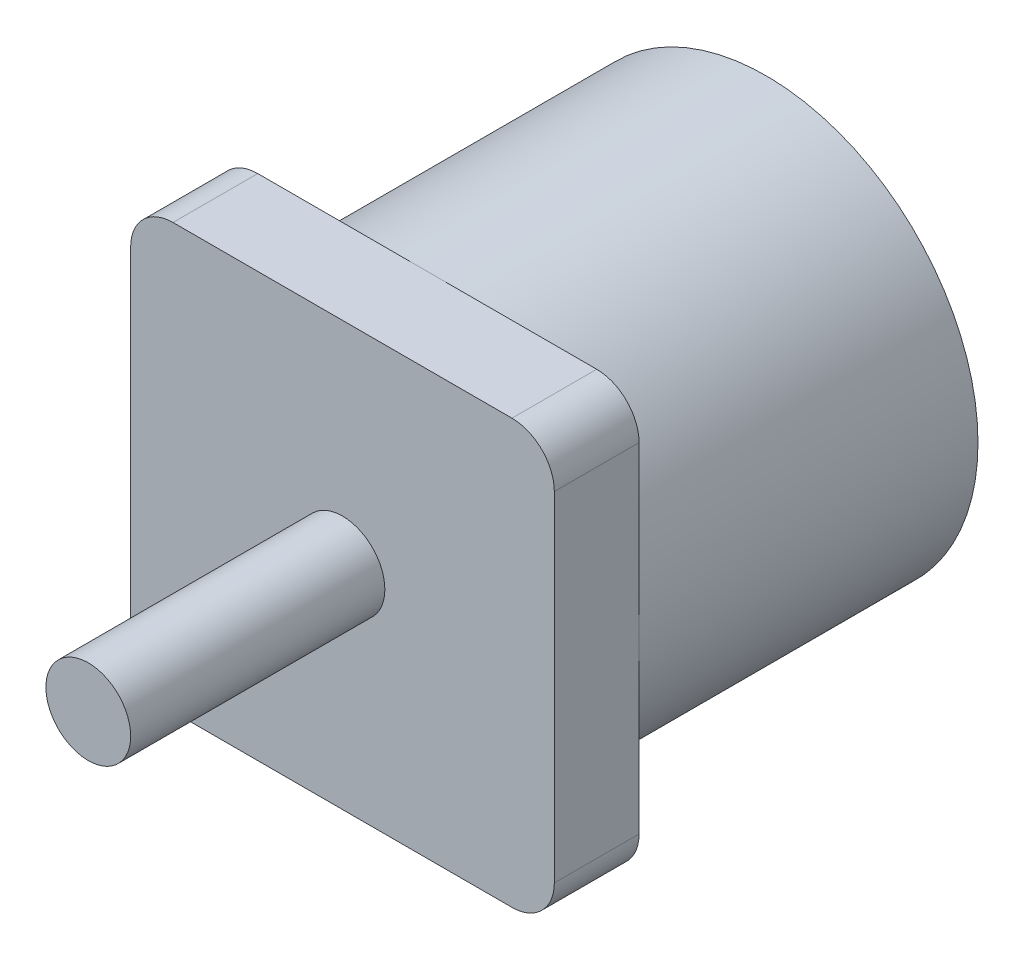
ISO-10303-21;
HEADER;
FILE_DESCRIPTION(('STEP AP214'),'2;1');
FILE_NAME('part.step','',(''),(''),'','','');
FILE_SCHEMA(('AUTOMOTIVE_DESIGN { 1 0 10303 214 1 1 1 1 }'));
ENDSEC;
DATA;
#1=APPLICATION_CONTEXT('core data for automotive mechanical design processes');
#2=APPLICATION_PROTOCOL_DEFINITION('international standard','automotive_design',2000,#1);
#3=PRODUCT_CONTEXT('',#1,'mechanical');
#4=PRODUCT('Part','Part','',(#3));
#5=PRODUCT_RELATED_PRODUCT_CATEGORY('part','',(#4));
#6=PRODUCT_DEFINITION_FORMATION('','',#4);
#7=PRODUCT_DEFINITION_CONTEXT('part definition',#1,'design');
#8=PRODUCT_DEFINITION('design','',#6,#7);
#9=PRODUCT_DEFINITION_SHAPE('','',#8);
#10=(LENGTH_UNIT() NAMED_UNIT(*) SI_UNIT(.MILLI.,.METRE.));
#11=(NAMED_UNIT(*) PLANE_ANGLE_UNIT() SI_UNIT($,.RADIAN.));
#12=(NAMED_UNIT(*) SI_UNIT($,.STERADIAN.) SOLID_ANGLE_UNIT());
#13=UNCERTAINTY_MEASURE_WITH_UNIT(LENGTH_MEASURE(1.E-05),#10,'distance_accuracy_value','');
#14=(GEOMETRIC_REPRESENTATION_CONTEXT(3) GLOBAL_UNCERTAINTY_ASSIGNED_CONTEXT((#13)) GLOBAL_UNIT_ASSIGNED_CONTEXT((#10,
#11,#12)) REPRESENTATION_CONTEXT('',''));
#15=CARTESIAN_POINT('',(0.,0.,0.));
#16=DIRECTION('',(0.,0.,1.));
#17=DIRECTION('',(1.,0.,0.));
#18=AXIS2_PLACEMENT_3D('',#15,#16,#17);
#19=CARTESIAN_POINT('',(0.,0.,50.));
#20=DIRECTION('',(0.,0.,1.));
#21=DIRECTION('',(1.,0.,0.));
#22=AXIS2_PLACEMENT_3D('',#19,#20,#21);
#23=PLANE('',#22);
#24=DIRECTION('',(-1.,0.,0.));
#25=VECTOR('',#24,1.);
#26=CARTESIAN_POINT('',(-25.,25.,50.));
#27=LINE('',#26,#25);
#28=CARTESIAN_POINT('',(20.,25.,50.));
#29=VERTEX_POINT('',#28);
#30=CARTESIAN_POINT('',(-20.,25.,50.));
#31=VERTEX_POINT('',#30);
#32=EDGE_CURVE('E158',#29,#31,#27,.T.);
#33=ORIENTED_EDGE('',*,*,#32,.T.);
#34=CARTESIAN_POINT('',(-20.,20.,50.));
#35=DIRECTION('',(0.,0.,1.));
#36=DIRECTION('',(1.,0.,0.));
#37=AXIS2_PLACEMENT_3D('',#34,#35,#36);
#38=CIRCLE('',#37,5.);
#39=CARTESIAN_POINT('',(-25.,20.,50.));
#40=VERTEX_POINT('',#39);
#41=EDGE_CURVE('E180',#31,#40,#38,.T.);
#42=ORIENTED_EDGE('',*,*,#41,.T.);
#43=DIRECTION('',(0.,-1.,0.));
#44=VECTOR('',#43,1.);
#45=CARTESIAN_POINT('',(-25.,25.,50.));
#46=LINE('',#45,#44);
#47=CARTESIAN_POINT('',(-25.,-20.,50.));
#48=VERTEX_POINT('',#47);
#49=EDGE_CURVE('E144',#40,#48,#46,.T.);
#50=ORIENTED_EDGE('',*,*,#49,.T.);
#51=CARTESIAN_POINT('',(-20.,-20.,50.));
#52=DIRECTION('',(0.,0.,1.));
#53=DIRECTION('',(1.,0.,0.));
#54=AXIS2_PLACEMENT_3D('',#51,#52,#53);
#55=CIRCLE('',#54,5.);
#56=CARTESIAN_POINT('',(-20.,-25.,50.));
#57=VERTEX_POINT('',#56);
#58=EDGE_CURVE('E178',#48,#57,#55,.T.);
#59=ORIENTED_EDGE('',*,*,#58,.T.);
#60=DIRECTION('',(1.,0.,0.));
#61=VECTOR('',#60,1.);
#62=CARTESIAN_POINT('',(-25.,-25.,50.));
#63=LINE('',#62,#61);
#64=CARTESIAN_POINT('',(20.,-25.,50.));
#65=VERTEX_POINT('',#64);
#66=EDGE_CURVE('E142',#57,#65,#63,.T.);
#67=ORIENTED_EDGE('',*,*,#66,.T.);
#68=CARTESIAN_POINT('',(20.,-20.,50.));
#69=DIRECTION('',(0.,0.,1.));
#70=DIRECTION('',(1.,0.,0.));
#71=AXIS2_PLACEMENT_3D('',#68,#69,#70);
#72=CIRCLE('',#71,5.);
#73=CARTESIAN_POINT('',(25.,-20.,50.));
#74=VERTEX_POINT('',#73);
#75=EDGE_CURVE('E176',#65,#74,#72,.T.);
#76=ORIENTED_EDGE('',*,*,#75,.T.);
#77=DIRECTION('',(0.,1.,0.));
#78=VECTOR('',#77,1.);
#79=CARTESIAN_POINT('',(25.,25.,50.));
#80=LINE('',#79,#78);
#81=CARTESIAN_POINT('',(25.,20.,50.));
#82=VERTEX_POINT('',#81);
#83=EDGE_CURVE('E155',#74,#82,#80,.T.);
#84=ORIENTED_EDGE('',*,*,#83,.T.);
#85=CARTESIAN_POINT('',(20.,20.,50.));
#86=DIRECTION('',(0.,0.,1.));
#87=DIRECTION('',(1.,0.,0.));
#88=AXIS2_PLACEMENT_3D('',#85,#86,#87);
#89=CIRCLE('',#88,5.);
#90=EDGE_CURVE('E174',#82,#29,#89,.T.);
#91=ORIENTED_EDGE('',*,*,#90,.T.);
#92=EDGE_LOOP('',(#33,#42,#50,#59,#67,#76,#84,#91));
#93=FACE_BOUND('',#92,.T.);
#94=CARTESIAN_POINT('',(0.,0.,50.));
#95=DIRECTION('',(0.,0.,1.));
#96=DIRECTION('',(1.,0.,0.));
#97=AXIS2_PLACEMENT_3D('',#94,#95,#96);
#98=CIRCLE('',#97,5.);
#99=CARTESIAN_POINT('',(5.,0.,50.));
#100=VERTEX_POINT('',#99);
#101=EDGE_CURVE('E154',#100,#100,#98,.T.);
#102=ORIENTED_EDGE('',*,*,#101,.F.);
#103=EDGE_LOOP('',(#102));
#104=FACE_BOUND('',#103,.T.);
#105=ADVANCED_FACE('F35',(#93,#104),#23,.T.);
#106=CARTESIAN_POINT('',(0.,0.,80.));
#107=DIRECTION('',(0.,0.,-1.));
#108=DIRECTION('',(-1.,0.,0.));
#109=AXIS2_PLACEMENT_3D('',#106,#107,#108);
#110=CYLINDRICAL_SURFACE('',#109,5.);
#111=CARTESIAN_POINT('',(0.,0.,80.));
#112=DIRECTION('',(0.,0.,1.));
#113=DIRECTION('',(1.,0.,0.));
#114=AXIS2_PLACEMENT_3D('',#111,#112,#113);
#115=CIRCLE('',#114,5.);
#116=CARTESIAN_POINT('',(5.,0.,80.));
#117=VERTEX_POINT('',#116);
#118=EDGE_CURVE('E163',#117,#117,#115,.T.);
#119=ORIENTED_EDGE('',*,*,#118,.F.);
#120=EDGE_LOOP('',(#119));
#121=FACE_BOUND('',#120,.T.);
#122=ORIENTED_EDGE('',*,*,#101,.T.);
#123=EDGE_LOOP('',(#122));
#124=FACE_BOUND('',#123,.T.);
#125=ADVANCED_FACE('F241',(#121,#124),#110,.T.);
#126=CARTESIAN_POINT('',(0.,0.,80.));
#127=DIRECTION('',(0.,0.,1.));
#128=DIRECTION('',(1.,0.,0.));
#129=AXIS2_PLACEMENT_3D('',#126,#127,#128);
#130=PLANE('',#129);
#131=ORIENTED_EDGE('',*,*,#118,.T.);
#132=EDGE_LOOP('',(#131));
#133=FACE_BOUND('',#132,.T.);
#134=ADVANCED_FACE('F246',(#133),#130,.T.);
#135=CARTESIAN_POINT('',(25.,25.,40.));
#136=DIRECTION('',(1.,0.,0.));
#137=DIRECTION('',(0.,1.,0.));
#138=AXIS2_PLACEMENT_3D('',#135,#136,#137);
#139=PLANE('',#138);
#140=ORIENTED_EDGE('',*,*,#83,.F.);
#141=DIRECTION('',(0.,0.,1.));
#142=VECTOR('',#141,1.);
#143=CARTESIAN_POINT('',(25.,-20.,40.));
#144=LINE('',#143,#142);
#145=CARTESIAN_POINT('',(25.,-20.,40.));
#146=VERTEX_POINT('',#145);
#147=EDGE_CURVE('E56',#74,#146,#144,.F.);
#148=ORIENTED_EDGE('',*,*,#147,.T.);
#149=DIRECTION('',(0.,1.,0.));
#150=VECTOR('',#149,1.);
#151=CARTESIAN_POINT('',(25.,25.,40.));
#152=LINE('',#151,#150);
#153=CARTESIAN_POINT('',(25.,0.,40.));
#154=VERTEX_POINT('',#153);
#155=EDGE_CURVE('E110',#146,#154,#152,.T.);
#156=ORIENTED_EDGE('',*,*,#155,.T.);
#157=CARTESIAN_POINT('',(25.,20.,40.));
#158=VERTEX_POINT('',#157);
#159=EDGE_CURVE('E114',#154,#158,#152,.T.);
#160=ORIENTED_EDGE('',*,*,#159,.T.);
#161=DIRECTION('',(0.,0.,1.));
#162=VECTOR('',#161,1.);
#163=CARTESIAN_POINT('',(25.,20.,40.));
#164=LINE('',#163,#162);
#165=EDGE_CURVE('E196',#158,#82,#164,.T.);
#166=ORIENTED_EDGE('',*,*,#165,.T.);
#167=EDGE_LOOP('',(#140,#148,#156,#160,#166));
#168=FACE_BOUND('',#167,.T.);
#169=ADVANCED_FACE('F112',(#168),#139,.T.);
#170=CARTESIAN_POINT('',(-25.,-25.,40.));
#171=DIRECTION('',(0.,-1.,0.));
#172=DIRECTION('',(0.,0.,-1.));
#173=AXIS2_PLACEMENT_3D('',#170,#171,#172);
#174=PLANE('',#173);
#175=ORIENTED_EDGE('',*,*,#66,.F.);
#176=DIRECTION('',(0.,0.,1.));
#177=VECTOR('',#176,1.);
#178=CARTESIAN_POINT('',(-20.,-25.,40.));
#179=LINE('',#178,#177);
#180=CARTESIAN_POINT('',(-20.,-25.,40.));
#181=VERTEX_POINT('',#180);
#182=EDGE_CURVE('E192',#57,#181,#179,.F.);
#183=ORIENTED_EDGE('',*,*,#182,.T.);
#184=DIRECTION('',(1.,0.,0.));
#185=VECTOR('',#184,1.);
#186=CARTESIAN_POINT('',(-25.,-25.,40.));
#187=LINE('',#186,#185);
#188=CARTESIAN_POINT('',(0.,-25.,40.));
#189=VERTEX_POINT('',#188);
#190=EDGE_CURVE('E152',#181,#189,#187,.T.);
#191=ORIENTED_EDGE('',*,*,#190,.T.);
#192=CARTESIAN_POINT('',(20.,-25.,40.));
#193=VERTEX_POINT('',#192);
#194=EDGE_CURVE('E138',#189,#193,#187,.T.);
#195=ORIENTED_EDGE('',*,*,#194,.T.);
#196=DIRECTION('',(0.,0.,1.));
#197=VECTOR('',#196,1.);
#198=CARTESIAN_POINT('',(20.,-25.,40.));
#199=LINE('',#198,#197);
#200=EDGE_CURVE('E189',#193,#65,#199,.T.);
#201=ORIENTED_EDGE('',*,*,#200,.T.);
#202=EDGE_LOOP('',(#175,#183,#191,#195,#201));
#203=FACE_BOUND('',#202,.T.);
#204=ADVANCED_FACE('F202',(#203),#174,.T.);
#205=CARTESIAN_POINT('',(-25.,25.,40.));
#206=DIRECTION('',(-1.,0.,0.));
#207=DIRECTION('',(0.,-1.,0.));
#208=AXIS2_PLACEMENT_3D('',#205,#206,#207);
#209=PLANE('',#208);
#210=ORIENTED_EDGE('',*,*,#49,.F.);
#211=DIRECTION('',(0.,0.,1.));
#212=VECTOR('',#211,1.);
#213=CARTESIAN_POINT('',(-25.,20.,40.));
#214=LINE('',#213,#212);
#215=CARTESIAN_POINT('',(-25.,20.,40.));
#216=VERTEX_POINT('',#215);
#217=EDGE_CURVE('E185',#40,#216,#214,.F.);
#218=ORIENTED_EDGE('',*,*,#217,.T.);
#219=DIRECTION('',(0.,-1.,0.));
#220=VECTOR('',#219,1.);
#221=CARTESIAN_POINT('',(-25.,25.,40.));
#222=LINE('',#221,#220);
#223=CARTESIAN_POINT('',(-25.,0.,40.));
#224=VERTEX_POINT('',#223);
#225=EDGE_CURVE('E150',#216,#224,#222,.T.);
#226=ORIENTED_EDGE('',*,*,#225,.T.);
#227=CARTESIAN_POINT('',(-25.,-20.,40.));
#228=VERTEX_POINT('',#227);
#229=EDGE_CURVE('E149',#224,#228,#222,.T.);
#230=ORIENTED_EDGE('',*,*,#229,.T.);
#231=DIRECTION('',(0.,0.,1.));
#232=VECTOR('',#231,1.);
#233=CARTESIAN_POINT('',(-25.,-20.,40.));
#234=LINE('',#233,#232);
#235=EDGE_CURVE('E182',#228,#48,#234,.T.);
#236=ORIENTED_EDGE('',*,*,#235,.T.);
#237=EDGE_LOOP('',(#210,#218,#226,#230,#236));
#238=FACE_BOUND('',#237,.T.);
#239=ADVANCED_FACE('F220',(#238),#209,.T.);
#240=CARTESIAN_POINT('',(-25.,25.,40.));
#241=DIRECTION('',(0.,1.,0.));
#242=DIRECTION('',(0.,0.,1.));
#243=AXIS2_PLACEMENT_3D('',#240,#241,#242);
#244=PLANE('',#243);
#245=DIRECTION('',(-1.,0.,0.));
#246=VECTOR('',#245,1.);
#247=CARTESIAN_POINT('',(-25.,25.,40.));
#248=LINE('',#247,#246);
#249=CARTESIAN_POINT('',(0.,25.,40.));
#250=VERTEX_POINT('',#249);
#251=CARTESIAN_POINT('',(-20.,25.,40.));
#252=VERTEX_POINT('',#251);
#253=EDGE_CURVE('E119',#250,#252,#248,.T.);
#254=ORIENTED_EDGE('',*,*,#253,.T.);
#255=DIRECTION('',(0.,0.,1.));
#256=VECTOR('',#255,1.);
#257=CARTESIAN_POINT('',(-20.,25.,40.));
#258=LINE('',#257,#256);
#259=EDGE_CURVE('E171',#252,#31,#258,.T.);
#260=ORIENTED_EDGE('',*,*,#259,.T.);
#261=ORIENTED_EDGE('',*,*,#32,.F.);
#262=DIRECTION('',(0.,0.,1.));
#263=VECTOR('',#262,1.);
#264=CARTESIAN_POINT('',(20.,25.,40.));
#265=LINE('',#264,#263);
#266=CARTESIAN_POINT('',(20.,25.,40.));
#267=VERTEX_POINT('',#266);
#268=EDGE_CURVE('E133',#29,#267,#265,.F.);
#269=ORIENTED_EDGE('',*,*,#268,.T.);
#270=EDGE_CURVE('E147',#267,#250,#248,.T.);
#271=ORIENTED_EDGE('',*,*,#270,.T.);
#272=EDGE_LOOP('',(#254,#260,#261,#269,#271));
#273=FACE_BOUND('',#272,.T.);
#274=ADVANCED_FACE('F212',(#273),#244,.T.);
#275=CARTESIAN_POINT('',(0.,0.,40.));
#276=DIRECTION('',(0.,0.,1.));
#277=DIRECTION('',(1.,0.,0.));
#278=AXIS2_PLACEMENT_3D('',#275,#276,#277);
#279=PLANE('',#278);
#280=ORIENTED_EDGE('',*,*,#270,.F.);
#281=CARTESIAN_POINT('',(20.,20.,40.));
#282=DIRECTION('',(0.,0.,1.));
#283=DIRECTION('',(1.,0.,0.));
#284=AXIS2_PLACEMENT_3D('',#281,#282,#283);
#285=CIRCLE('',#284,5.);
#286=EDGE_CURVE('E11',#267,#158,#285,.F.);
#287=ORIENTED_EDGE('',*,*,#286,.T.);
#288=ORIENTED_EDGE('',*,*,#159,.F.);
#289=CARTESIAN_POINT('',(0.,0.,40.));
#290=DIRECTION('',(0.,0.,1.));
#291=DIRECTION('',(1.,0.,0.));
#292=AXIS2_PLACEMENT_3D('',#289,#290,#291);
#293=CIRCLE('',#292,25.);
#294=EDGE_CURVE('E125',#154,#250,#293,.T.);
#295=ORIENTED_EDGE('',*,*,#294,.T.);
#296=EDGE_LOOP('',(#280,#287,#288,#295));
#297=FACE_BOUND('',#296,.T.);
#298=ADVANCED_FACE('F141',(#297),#279,.F.);
#299=ORIENTED_EDGE('',*,*,#225,.F.);
#300=CARTESIAN_POINT('',(-20.,20.,40.));
#301=DIRECTION('',(0.,0.,1.));
#302=DIRECTION('',(1.,0.,0.));
#303=AXIS2_PLACEMENT_3D('',#300,#301,#302);
#304=CIRCLE('',#303,5.);
#305=EDGE_CURVE('E187',#216,#252,#304,.F.);
#306=ORIENTED_EDGE('',*,*,#305,.T.);
#307=ORIENTED_EDGE('',*,*,#253,.F.);
#308=EDGE_CURVE('E131',#250,#224,#293,.T.);
#309=ORIENTED_EDGE('',*,*,#308,.T.);
#310=EDGE_LOOP('',(#299,#306,#307,#309));
#311=FACE_BOUND('',#310,.T.);
#312=ADVANCED_FACE('F232',(#311),#279,.F.);
#313=ORIENTED_EDGE('',*,*,#190,.F.);
#314=CARTESIAN_POINT('',(-20.,-20.,40.));
#315=DIRECTION('',(0.,0.,1.));
#316=DIRECTION('',(1.,0.,0.));
#317=AXIS2_PLACEMENT_3D('',#314,#315,#316);
#318=CIRCLE('',#317,5.);
#319=EDGE_CURVE('E194',#181,#228,#318,.F.);
#320=ORIENTED_EDGE('',*,*,#319,.T.);
#321=ORIENTED_EDGE('',*,*,#229,.F.);
#322=EDGE_CURVE('E139',#224,#189,#293,.T.);
#323=ORIENTED_EDGE('',*,*,#322,.T.);
#324=EDGE_LOOP('',(#313,#320,#321,#323));
#325=FACE_BOUND('',#324,.T.);
#326=ADVANCED_FACE('F230',(#325),#279,.F.);
#327=ORIENTED_EDGE('',*,*,#155,.F.);
#328=CARTESIAN_POINT('',(20.,-20.,40.));
#329=DIRECTION('',(0.,0.,1.));
#330=DIRECTION('',(1.,0.,0.));
#331=AXIS2_PLACEMENT_3D('',#328,#329,#330);
#332=CIRCLE('',#331,5.);
#333=EDGE_CURVE('E43',#146,#193,#332,.F.);
#334=ORIENTED_EDGE('',*,*,#333,.T.);
#335=ORIENTED_EDGE('',*,*,#194,.F.);
#336=EDGE_CURVE('E128',#189,#154,#293,.T.);
#337=ORIENTED_EDGE('',*,*,#336,.T.);
#338=EDGE_LOOP('',(#327,#334,#335,#337));
#339=FACE_BOUND('',#338,.T.);
#340=ADVANCED_FACE('F136',(#339),#279,.F.);
#341=CARTESIAN_POINT('',(0.,0.,0.));
#342=DIRECTION('',(0.,0.,1.));
#343=DIRECTION('',(1.,0.,0.));
#344=AXIS2_PLACEMENT_3D('',#341,#342,#343);
#345=PLANE('',#344);
#346=CARTESIAN_POINT('',(0.,0.,0.));
#347=DIRECTION('',(0.,0.,1.));
#348=DIRECTION('',(1.,0.,0.));
#349=AXIS2_PLACEMENT_3D('',#346,#347,#348);
#350=CIRCLE('',#349,25.);
#351=CARTESIAN_POINT('',(25.,0.,0.));
#352=VERTEX_POINT('',#351);
#353=EDGE_CURVE('E140',#352,#352,#350,.T.);
#354=ORIENTED_EDGE('',*,*,#353,.F.);
#355=EDGE_LOOP('',(#354));
#356=FACE_BOUND('',#355,.T.);
#357=ADVANCED_FACE('F251',(#356),#345,.F.);
#358=CARTESIAN_POINT('',(0.,0.,50.));
#359=DIRECTION('',(0.,0.,-1.));
#360=DIRECTION('',(-1.,0.,0.));
#361=AXIS2_PLACEMENT_3D('',#358,#359,#360);
#362=CYLINDRICAL_SURFACE('',#361,25.);
#363=ORIENTED_EDGE('',*,*,#353,.T.);
#364=EDGE_LOOP('',(#363));
#365=FACE_BOUND('',#364,.T.);
#366=ORIENTED_EDGE('',*,*,#294,.F.);
#367=ORIENTED_EDGE('',*,*,#336,.F.);
#368=ORIENTED_EDGE('',*,*,#322,.F.);
#369=ORIENTED_EDGE('',*,*,#308,.F.);
#370=EDGE_LOOP('',(#366,#367,#368,#369));
#371=FACE_BOUND('',#370,.T.);
#372=ADVANCED_FACE('F126',(#365,#371),#362,.T.);
#373=CARTESIAN_POINT('',(-20.,20.,40.));
#374=DIRECTION('',(0.,0.,1.));
#375=DIRECTION('',(1.,0.,0.));
#376=AXIS2_PLACEMENT_3D('',#373,#374,#375);
#377=CYLINDRICAL_SURFACE('',#376,5.);
#378=ORIENTED_EDGE('',*,*,#305,.F.);
#379=ORIENTED_EDGE('',*,*,#217,.F.);
#380=ORIENTED_EDGE('',*,*,#41,.F.);
#381=ORIENTED_EDGE('',*,*,#259,.F.);
#382=EDGE_LOOP('',(#378,#379,#380,#381));
#383=FACE_BOUND('',#382,.T.);
#384=ADVANCED_FACE('F216',(#383),#377,.T.);
#385=CARTESIAN_POINT('',(-20.,-20.,40.));
#386=DIRECTION('',(0.,0.,1.));
#387=DIRECTION('',(1.,0.,0.));
#388=AXIS2_PLACEMENT_3D('',#385,#386,#387);
#389=CYLINDRICAL_SURFACE('',#388,5.);
#390=ORIENTED_EDGE('',*,*,#319,.F.);
#391=ORIENTED_EDGE('',*,*,#182,.F.);
#392=ORIENTED_EDGE('',*,*,#58,.F.);
#393=ORIENTED_EDGE('',*,*,#235,.F.);
#394=EDGE_LOOP('',(#390,#391,#392,#393));
#395=FACE_BOUND('',#394,.T.);
#396=ADVANCED_FACE('F227',(#395),#389,.T.);
#397=CARTESIAN_POINT('',(20.,-20.,40.));
#398=DIRECTION('',(0.,0.,1.));
#399=DIRECTION('',(1.,0.,0.));
#400=AXIS2_PLACEMENT_3D('',#397,#398,#399);
#401=CYLINDRICAL_SURFACE('',#400,5.);
#402=ORIENTED_EDGE('',*,*,#333,.F.);
#403=ORIENTED_EDGE('',*,*,#147,.F.);
#404=ORIENTED_EDGE('',*,*,#75,.F.);
#405=ORIENTED_EDGE('',*,*,#200,.F.);
#406=EDGE_LOOP('',(#402,#403,#404,#405));
#407=FACE_BOUND('',#406,.T.);
#408=ADVANCED_FACE('F204',(#407),#401,.T.);
#409=CARTESIAN_POINT('',(20.,20.,40.));
#410=DIRECTION('',(0.,0.,1.));
#411=DIRECTION('',(1.,0.,0.));
#412=AXIS2_PLACEMENT_3D('',#409,#410,#411);
#413=CYLINDRICAL_SURFACE('',#412,5.);
#414=ORIENTED_EDGE('',*,*,#286,.F.);
#415=ORIENTED_EDGE('',*,*,#268,.F.);
#416=ORIENTED_EDGE('',*,*,#90,.F.);
#417=ORIENTED_EDGE('',*,*,#165,.F.);
#418=EDGE_LOOP('',(#414,#415,#416,#417));
#419=FACE_BOUND('',#418,.T.);
#420=ADVANCED_FACE('F37',(#419),#413,.T.);
#421=CLOSED_SHELL('',(#105,#125,#134,#169,#204,#239,#274,#298,#312,#326,#340,#357,#372,#384,
#396,#408,#420));
#422=MANIFOLD_SOLID_BREP('B2',#421);
#423=ADVANCED_BREP_SHAPE_REPRESENTATION('',(#18,#422),#14);
#424=SHAPE_DEFINITION_REPRESENTATION(#9,#423);
ENDSEC;
END-ISO-10303-21;
